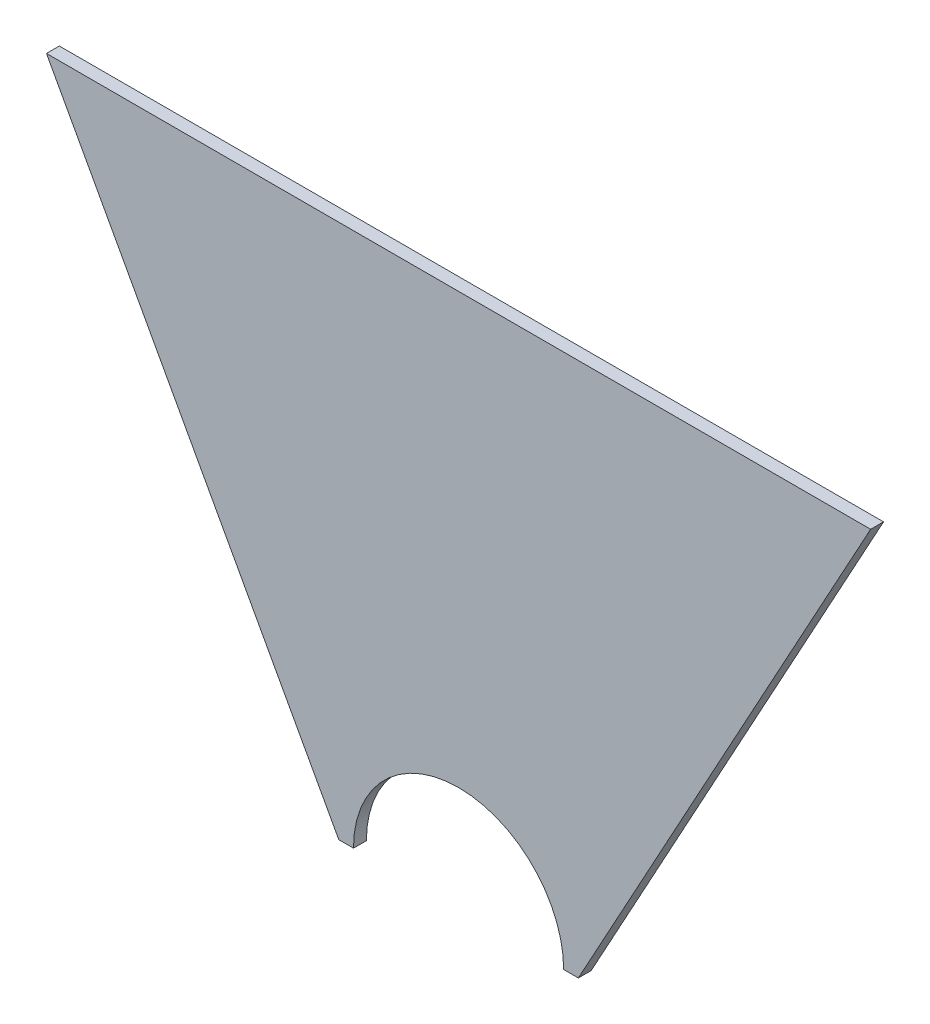
ISO-10303-21;
HEADER;
FILE_DESCRIPTION(('STEP AP214'),'2;1');
FILE_NAME('part.step','',(''),(''),'','','');
FILE_SCHEMA(('AUTOMOTIVE_DESIGN { 1 0 10303 214 1 1 1 1 }'));
ENDSEC;
DATA;
#1=APPLICATION_CONTEXT('core data for automotive mechanical design processes');
#2=APPLICATION_PROTOCOL_DEFINITION('international standard','automotive_design',2000,#1);
#3=PRODUCT_CONTEXT('',#1,'mechanical');
#4=PRODUCT('Part','Part','',(#3));
#5=PRODUCT_RELATED_PRODUCT_CATEGORY('part','',(#4));
#6=PRODUCT_DEFINITION_FORMATION('','',#4);
#7=PRODUCT_DEFINITION_CONTEXT('part definition',#1,'design');
#8=PRODUCT_DEFINITION('design','',#6,#7);
#9=PRODUCT_DEFINITION_SHAPE('','',#8);
#10=(LENGTH_UNIT() NAMED_UNIT(*) SI_UNIT(.MILLI.,.METRE.));
#11=(NAMED_UNIT(*) PLANE_ANGLE_UNIT() SI_UNIT($,.RADIAN.));
#12=(NAMED_UNIT(*) SI_UNIT($,.STERADIAN.) SOLID_ANGLE_UNIT());
#13=UNCERTAINTY_MEASURE_WITH_UNIT(LENGTH_MEASURE(1.E-05),#10,'distance_accuracy_value','');
#14=(GEOMETRIC_REPRESENTATION_CONTEXT(3) GLOBAL_UNCERTAINTY_ASSIGNED_CONTEXT((#13)) GLOBAL_UNIT_ASSIGNED_CONTEXT((#10,
#11,#12)) REPRESENTATION_CONTEXT('',''));
#15=CARTESIAN_POINT('',(0.,0.,0.));
#16=DIRECTION('',(0.,0.,1.));
#17=DIRECTION('',(1.,0.,0.));
#18=AXIS2_PLACEMENT_3D('',#15,#16,#17);
#19=CARTESIAN_POINT('',(0.,0.,1.5875));
#20=DIRECTION('',(0.,0.,-1.));
#21=DIRECTION('',(-1.,0.,0.));
#22=AXIS2_PLACEMENT_3D('',#19,#20,#21);
#23=CYLINDRICAL_SURFACE('',#22,12.954);
#24=CARTESIAN_POINT('',(0.,0.,0.));
#25=DIRECTION('',(0.,0.,-1.));
#26=DIRECTION('',(1.,0.,0.));
#27=AXIS2_PLACEMENT_3D('',#24,#25,#26);
#28=CIRCLE('',#27,12.954);
#29=CARTESIAN_POINT('',(-12.954,0.,0.));
#30=VERTEX_POINT('',#29);
#31=CARTESIAN_POINT('',(12.954,0.,0.));
#32=VERTEX_POINT('',#31);
#33=EDGE_CURVE('E117',#30,#32,#28,.T.);
#34=ORIENTED_EDGE('',*,*,#33,.T.);
#35=DIRECTION('',(0.,0.,-1.));
#36=VECTOR('',#35,1.);
#37=CARTESIAN_POINT('',(12.954,0.,1.5875));
#38=LINE('',#37,#36);
#39=CARTESIAN_POINT('',(12.954,0.,1.5875));
#40=VERTEX_POINT('',#39);
#41=EDGE_CURVE('E11',#40,#32,#38,.T.);
#42=ORIENTED_EDGE('',*,*,#41,.F.);
#43=CARTESIAN_POINT('',(0.,0.,1.5875));
#44=DIRECTION('',(0.,0.,-1.));
#45=DIRECTION('',(1.,0.,0.));
#46=AXIS2_PLACEMENT_3D('',#43,#44,#45);
#47=CIRCLE('',#46,12.954);
#48=CARTESIAN_POINT('',(-12.954,0.,1.5875));
#49=VERTEX_POINT('',#48);
#50=EDGE_CURVE('E127',#49,#40,#47,.T.);
#51=ORIENTED_EDGE('',*,*,#50,.F.);
#52=DIRECTION('',(0.,0.,-1.));
#53=VECTOR('',#52,1.);
#54=CARTESIAN_POINT('',(-12.954,0.,1.5875));
#55=LINE('',#54,#53);
#56=EDGE_CURVE('E113',#49,#30,#55,.T.);
#57=ORIENTED_EDGE('',*,*,#56,.T.);
#58=EDGE_LOOP('',(#34,#42,#51,#57));
#59=FACE_BOUND('',#58,.T.);
#60=ADVANCED_FACE('F33',(#59),#23,.F.);
#61=CARTESIAN_POINT('',(12.954,0.,1.5875));
#62=DIRECTION('',(0.,1.,0.));
#63=DIRECTION('',(0.,0.,1.));
#64=AXIS2_PLACEMENT_3D('',#61,#62,#63);
#65=PLANE('',#64);
#66=DIRECTION('',(1.,0.,0.));
#67=VECTOR('',#66,1.);
#68=CARTESIAN_POINT('',(12.954,0.,0.));
#69=LINE('',#68,#67);
#70=CARTESIAN_POINT('',(14.763217877095,0.,0.));
#71=VERTEX_POINT('',#70);
#72=EDGE_CURVE('E120',#32,#71,#69,.T.);
#73=ORIENTED_EDGE('',*,*,#72,.T.);
#74=DIRECTION('',(0.,0.,-1.));
#75=VECTOR('',#74,1.);
#76=CARTESIAN_POINT('',(14.763217877095,0.,1.5875));
#77=LINE('',#76,#75);
#78=CARTESIAN_POINT('',(14.763217877095,0.,1.5875));
#79=VERTEX_POINT('',#78);
#80=EDGE_CURVE('E41',#79,#71,#77,.T.);
#81=ORIENTED_EDGE('',*,*,#80,.F.);
#82=DIRECTION('',(1.,0.,0.));
#83=VECTOR('',#82,1.);
#84=CARTESIAN_POINT('',(12.954,0.,1.5875));
#85=LINE('',#84,#83);
#86=EDGE_CURVE('E86',#40,#79,#85,.T.);
#87=ORIENTED_EDGE('',*,*,#86,.F.);
#88=ORIENTED_EDGE('',*,*,#41,.T.);
#89=EDGE_LOOP('',(#73,#81,#87,#88));
#90=FACE_BOUND('',#89,.T.);
#91=ADVANCED_FACE('F151',(#90),#65,.F.);
#92=CARTESIAN_POINT('',(14.763217877095,0.,1.5875));
#93=DIRECTION('',(-0.877450980392157,0.479666318401494,0.));
#94=DIRECTION('',(-0.479666318401494,-0.877450980392157,0.));
#95=AXIS2_PLACEMENT_3D('',#92,#93,#94);
#96=PLANE('',#95);
#97=DIRECTION('',(0.479666318401494,0.877450980392157,0.));
#98=VECTOR('',#97,1.);
#99=CARTESIAN_POINT('',(14.763217877095,0.,0.));
#100=LINE('',#99,#98);
#101=CARTESIAN_POINT('',(50.8,65.9218890108818,0.));
#102=VERTEX_POINT('',#101);
#103=EDGE_CURVE('E122',#71,#102,#100,.T.);
#104=ORIENTED_EDGE('',*,*,#103,.T.);
#105=DIRECTION('',(0.,0.,-1.));
#106=VECTOR('',#105,1.);
#107=CARTESIAN_POINT('',(50.8,65.9218890108818,1.5875));
#108=LINE('',#107,#106);
#109=CARTESIAN_POINT('',(50.8,65.9218890108818,1.5875));
#110=VERTEX_POINT('',#109);
#111=EDGE_CURVE('E108',#110,#102,#108,.T.);
#112=ORIENTED_EDGE('',*,*,#111,.F.);
#113=DIRECTION('',(0.479666318401494,0.877450980392157,0.));
#114=VECTOR('',#113,1.);
#115=CARTESIAN_POINT('',(14.763217877095,0.,1.5875));
#116=LINE('',#115,#114);
#117=EDGE_CURVE('E99',#79,#110,#116,.T.);
#118=ORIENTED_EDGE('',*,*,#117,.F.);
#119=ORIENTED_EDGE('',*,*,#80,.T.);
#120=EDGE_LOOP('',(#104,#112,#118,#119));
#121=FACE_BOUND('',#120,.T.);
#122=ADVANCED_FACE('F133',(#121),#96,.F.);
#123=CARTESIAN_POINT('',(50.8,65.9218890108818,1.5875));
#124=DIRECTION('',(0.,-1.,0.));
#125=DIRECTION('',(1.,0.,0.));
#126=AXIS2_PLACEMENT_3D('',#123,#124,#125);
#127=PLANE('',#126);
#128=DIRECTION('',(-1.,0.,0.));
#129=VECTOR('',#128,1.);
#130=CARTESIAN_POINT('',(50.8,65.9218890108818,0.));
#131=LINE('',#130,#129);
#132=CARTESIAN_POINT('',(-50.8,65.9218890108818,0.));
#133=VERTEX_POINT('',#132);
#134=EDGE_CURVE('E107',#102,#133,#131,.T.);
#135=ORIENTED_EDGE('',*,*,#134,.T.);
#136=DIRECTION('',(0.,0.,-1.));
#137=VECTOR('',#136,1.);
#138=CARTESIAN_POINT('',(-50.8,65.9218890108818,1.5875));
#139=LINE('',#138,#137);
#140=CARTESIAN_POINT('',(-50.8,65.9218890108818,1.5875));
#141=VERTEX_POINT('',#140);
#142=EDGE_CURVE('E104',#141,#133,#139,.T.);
#143=ORIENTED_EDGE('',*,*,#142,.F.);
#144=DIRECTION('',(-1.,0.,0.));
#145=VECTOR('',#144,1.);
#146=CARTESIAN_POINT('',(50.8,65.9218890108818,1.5875));
#147=LINE('',#146,#145);
#148=EDGE_CURVE('E93',#110,#141,#147,.T.);
#149=ORIENTED_EDGE('',*,*,#148,.F.);
#150=ORIENTED_EDGE('',*,*,#111,.T.);
#151=EDGE_LOOP('',(#135,#143,#149,#150));
#152=FACE_BOUND('',#151,.T.);
#153=ADVANCED_FACE('F105',(#152),#127,.F.);
#154=CARTESIAN_POINT('',(-14.763217877095,0.,1.5875));
#155=DIRECTION('',(0.877450980392157,0.479666318401494,0.));
#156=DIRECTION('',(-0.479666318401494,0.877450980392157,0.));
#157=AXIS2_PLACEMENT_3D('',#154,#155,#156);
#158=PLANE('',#157);
#159=DIRECTION('',(0.479666318401494,-0.877450980392157,0.));
#160=VECTOR('',#159,1.);
#161=CARTESIAN_POINT('',(-14.763217877095,0.,0.));
#162=LINE('',#161,#160);
#163=CARTESIAN_POINT('',(-14.763217877095,0.,0.));
#164=VERTEX_POINT('',#163);
#165=EDGE_CURVE('E72',#133,#164,#162,.T.);
#166=ORIENTED_EDGE('',*,*,#165,.T.);
#167=DIRECTION('',(0.,0.,-1.));
#168=VECTOR('',#167,1.);
#169=CARTESIAN_POINT('',(-14.763217877095,0.,1.5875));
#170=LINE('',#169,#168);
#171=CARTESIAN_POINT('',(-14.763217877095,0.,1.5875));
#172=VERTEX_POINT('',#171);
#173=EDGE_CURVE('E109',#172,#164,#170,.T.);
#174=ORIENTED_EDGE('',*,*,#173,.F.);
#175=DIRECTION('',(0.479666318401494,-0.877450980392157,0.));
#176=VECTOR('',#175,1.);
#177=CARTESIAN_POINT('',(-14.763217877095,0.,1.5875));
#178=LINE('',#177,#176);
#179=EDGE_CURVE('E97',#141,#172,#178,.T.);
#180=ORIENTED_EDGE('',*,*,#179,.F.);
#181=ORIENTED_EDGE('',*,*,#142,.T.);
#182=EDGE_LOOP('',(#166,#174,#180,#181));
#183=FACE_BOUND('',#182,.T.);
#184=ADVANCED_FACE('F111',(#183),#158,.F.);
#185=CARTESIAN_POINT('',(-12.954,0.,1.5875));
#186=DIRECTION('',(0.,1.,0.));
#187=DIRECTION('',(-1.,0.,0.));
#188=AXIS2_PLACEMENT_3D('',#185,#186,#187);
#189=PLANE('',#188);
#190=DIRECTION('',(1.,0.,0.));
#191=VECTOR('',#190,1.);
#192=CARTESIAN_POINT('',(-12.954,0.,0.));
#193=LINE('',#192,#191);
#194=EDGE_CURVE('E78',#164,#30,#193,.T.);
#195=ORIENTED_EDGE('',*,*,#194,.T.);
#196=ORIENTED_EDGE('',*,*,#56,.F.);
#197=DIRECTION('',(1.,0.,0.));
#198=VECTOR('',#197,1.);
#199=CARTESIAN_POINT('',(-12.954,0.,1.5875));
#200=LINE('',#199,#198);
#201=EDGE_CURVE('E49',#172,#49,#200,.T.);
#202=ORIENTED_EDGE('',*,*,#201,.F.);
#203=ORIENTED_EDGE('',*,*,#173,.T.);
#204=EDGE_LOOP('',(#195,#196,#202,#203));
#205=FACE_BOUND('',#204,.T.);
#206=ADVANCED_FACE('F140',(#205),#189,.F.);
#207=CARTESIAN_POINT('',(0.,0.,1.5875));
#208=DIRECTION('',(0.,0.,1.));
#209=DIRECTION('',(1.,0.,0.));
#210=AXIS2_PLACEMENT_3D('',#207,#208,#209);
#211=PLANE('',#210);
#212=ORIENTED_EDGE('',*,*,#50,.T.);
#213=ORIENTED_EDGE('',*,*,#86,.T.);
#214=ORIENTED_EDGE('',*,*,#117,.T.);
#215=ORIENTED_EDGE('',*,*,#148,.T.);
#216=ORIENTED_EDGE('',*,*,#179,.T.);
#217=ORIENTED_EDGE('',*,*,#201,.T.);
#218=EDGE_LOOP('',(#212,#213,#214,#215,#216,#217));
#219=FACE_BOUND('',#218,.T.);
#220=ADVANCED_FACE('F95',(#219),#211,.T.);
#221=CARTESIAN_POINT('',(0.,0.,0.));
#222=DIRECTION('',(0.,0.,1.));
#223=DIRECTION('',(1.,0.,0.));
#224=AXIS2_PLACEMENT_3D('',#221,#222,#223);
#225=PLANE('',#224);
#226=ORIENTED_EDGE('',*,*,#33,.F.);
#227=ORIENTED_EDGE('',*,*,#194,.F.);
#228=ORIENTED_EDGE('',*,*,#165,.F.);
#229=ORIENTED_EDGE('',*,*,#134,.F.);
#230=ORIENTED_EDGE('',*,*,#103,.F.);
#231=ORIENTED_EDGE('',*,*,#72,.F.);
#232=EDGE_LOOP('',(#226,#227,#228,#229,#230,#231));
#233=FACE_BOUND('',#232,.T.);
#234=ADVANCED_FACE('F136',(#233),#225,.F.);
#235=CLOSED_SHELL('',(#60,#91,#122,#153,#184,#206,#220,#234));
#236=MANIFOLD_SOLID_BREP('B2',#235);
#237=ADVANCED_BREP_SHAPE_REPRESENTATION('',(#18,#236),#14);
#238=SHAPE_DEFINITION_REPRESENTATION(#9,#237);
ENDSEC;
END-ISO-10303-21;
